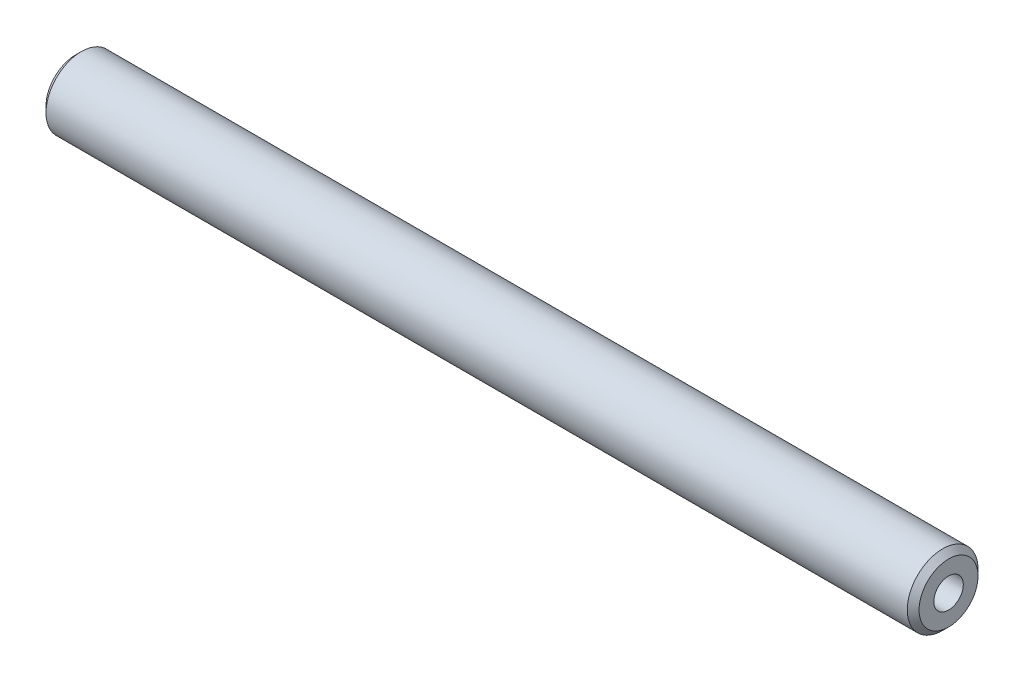
ISO-10303-21;
HEADER;
FILE_DESCRIPTION(('STEP AP214'),'2;1');
FILE_NAME('part.step','',(''),(''),'','','');
FILE_SCHEMA(('AUTOMOTIVE_DESIGN { 1 0 10303 214 1 1 1 1 }'));
ENDSEC;
DATA;
#1=APPLICATION_CONTEXT('core data for automotive mechanical design processes');
#2=APPLICATION_PROTOCOL_DEFINITION('international standard','automotive_design',2000,#1);
#3=PRODUCT_CONTEXT('',#1,'mechanical');
#4=PRODUCT('Part','Part','',(#3));
#5=PRODUCT_RELATED_PRODUCT_CATEGORY('part','',(#4));
#6=PRODUCT_DEFINITION_FORMATION('','',#4);
#7=PRODUCT_DEFINITION_CONTEXT('part definition',#1,'design');
#8=PRODUCT_DEFINITION('design','',#6,#7);
#9=PRODUCT_DEFINITION_SHAPE('','',#8);
#10=(LENGTH_UNIT() NAMED_UNIT(*) SI_UNIT(.MILLI.,.METRE.));
#11=(NAMED_UNIT(*) PLANE_ANGLE_UNIT() SI_UNIT($,.RADIAN.));
#12=(NAMED_UNIT(*) SI_UNIT($,.STERADIAN.) SOLID_ANGLE_UNIT());
#13=UNCERTAINTY_MEASURE_WITH_UNIT(LENGTH_MEASURE(1.E-05),#10,'distance_accuracy_value','');
#14=(GEOMETRIC_REPRESENTATION_CONTEXT(3) GLOBAL_UNCERTAINTY_ASSIGNED_CONTEXT((#13)) GLOBAL_UNIT_ASSIGNED_CONTEXT((#10,
#11,#12)) REPRESENTATION_CONTEXT('',''));
#15=CARTESIAN_POINT('',(0.,0.,0.));
#16=DIRECTION('',(0.,0.,1.));
#17=DIRECTION('',(1.,0.,0.));
#18=AXIS2_PLACEMENT_3D('',#15,#16,#17);
#19=CARTESIAN_POINT('',(0.,0.,0.));
#20=DIRECTION('',(1.,0.,0.));
#21=DIRECTION('',(0.,0.,-1.));
#22=AXIS2_PLACEMENT_3D('',#19,#20,#21);
#23=PLANE('',#22);
#24=CARTESIAN_POINT('',(0.,0.,0.));
#25=DIRECTION('',(1.,0.,0.));
#26=DIRECTION('',(0.,0.,-1.));
#27=AXIS2_PLACEMENT_3D('',#24,#25,#26);
#28=CIRCLE('',#27,2.49999999999999);
#29=CARTESIAN_POINT('',(0.,0.,-2.49999999999999));
#30=VERTEX_POINT('',#29);
#31=EDGE_CURVE('E78',#30,#30,#28,.F.);
#32=ORIENTED_EDGE('',*,*,#31,.T.);
#33=EDGE_LOOP('',(#32));
#34=FACE_BOUND('',#33,.T.);
#35=CARTESIAN_POINT('',(0.,0.,0.));
#36=DIRECTION('',(-1.,0.,0.));
#37=DIRECTION('',(0.,0.,1.));
#38=AXIS2_PLACEMENT_3D('',#35,#36,#37);
#39=CIRCLE('',#38,1.25);
#40=CARTESIAN_POINT('',(0.,0.,1.25));
#41=VERTEX_POINT('',#40);
#42=EDGE_CURVE('E67',#41,#41,#39,.T.);
#43=ORIENTED_EDGE('',*,*,#42,.F.);
#44=EDGE_LOOP('',(#43));
#45=FACE_BOUND('',#44,.T.);
#46=ADVANCED_FACE('F43',(#34,#45),#23,.F.);
#47=CARTESIAN_POINT('',(0.,0.,0.));
#48=DIRECTION('',(-1.,0.,0.));
#49=DIRECTION('',(0.,0.,1.));
#50=AXIS2_PLACEMENT_3D('',#47,#48,#49);
#51=CYLINDRICAL_SURFACE('',#50,3.);
#52=CARTESIAN_POINT('',(0.500000000000009,0.,0.));
#53=DIRECTION('',(1.,0.,0.));
#54=DIRECTION('',(0.,0.,-1.));
#55=AXIS2_PLACEMENT_3D('',#52,#53,#54);
#56=CIRCLE('',#55,3.);
#57=CARTESIAN_POINT('',(0.500000000000009,0.,-3.));
#58=VERTEX_POINT('',#57);
#59=EDGE_CURVE('E51',#58,#58,#56,.T.);
#60=ORIENTED_EDGE('',*,*,#59,.T.);
#61=EDGE_LOOP('',(#60));
#62=FACE_BOUND('',#61,.T.);
#63=CARTESIAN_POINT('',(73.5,0.,0.));
#64=DIRECTION('',(-1.,0.,0.));
#65=DIRECTION('',(0.,0.,1.));
#66=AXIS2_PLACEMENT_3D('',#63,#64,#65);
#67=CIRCLE('',#66,3.);
#68=CARTESIAN_POINT('',(73.5,0.,3.));
#69=VERTEX_POINT('',#68);
#70=EDGE_CURVE('E81',#69,#69,#67,.T.);
#71=ORIENTED_EDGE('',*,*,#70,.T.);
#72=EDGE_LOOP('',(#71));
#73=FACE_BOUND('',#72,.T.);
#74=ADVANCED_FACE('F86',(#62,#73),#51,.T.);
#75=CARTESIAN_POINT('',(74.,0.,0.));
#76=DIRECTION('',(-1.,0.,0.));
#77=DIRECTION('',(0.,0.,1.));
#78=AXIS2_PLACEMENT_3D('',#75,#76,#77);
#79=PLANE('',#78);
#80=CARTESIAN_POINT('',(74.,0.,0.));
#81=DIRECTION('',(-1.,0.,0.));
#82=DIRECTION('',(0.,0.,1.));
#83=AXIS2_PLACEMENT_3D('',#80,#81,#82);
#84=CIRCLE('',#83,2.49999999999999);
#85=CARTESIAN_POINT('',(74.,0.,2.49999999999999));
#86=VERTEX_POINT('',#85);
#87=EDGE_CURVE('E11',#86,#86,#84,.F.);
#88=ORIENTED_EDGE('',*,*,#87,.T.);
#89=EDGE_LOOP('',(#88));
#90=FACE_BOUND('',#89,.T.);
#91=CARTESIAN_POINT('',(74.,0.,0.));
#92=DIRECTION('',(1.,0.,0.));
#93=DIRECTION('',(0.,0.,-1.));
#94=AXIS2_PLACEMENT_3D('',#91,#92,#93);
#95=CIRCLE('',#94,1.24999999999999);
#96=CARTESIAN_POINT('',(74.,0.,-1.24999999999999));
#97=VERTEX_POINT('',#96);
#98=EDGE_CURVE('E68',#97,#97,#95,.T.);
#99=ORIENTED_EDGE('',*,*,#98,.F.);
#100=EDGE_LOOP('',(#99));
#101=FACE_BOUND('',#100,.T.);
#102=ADVANCED_FACE('F106',(#90,#101),#79,.F.);
#103=CARTESIAN_POINT('',(8.5,0.,0.));
#104=DIRECTION('',(-1.,0.,0.));
#105=DIRECTION('',(0.,0.,1.));
#106=AXIS2_PLACEMENT_3D('',#103,#104,#105);
#107=CONICAL_SURFACE('',#106,1.25,1.02974425867666);
#108=CARTESIAN_POINT('',(9.25107577378445,0.,0.));
#109=VERTEX_POINT('',#108);
#110=VERTEX_LOOP('',#109);
#111=FACE_BOUND('',#110,.T.);
#112=CARTESIAN_POINT('',(8.5,0.,0.));
#113=DIRECTION('',(-1.,0.,0.));
#114=DIRECTION('',(0.,0.,1.));
#115=AXIS2_PLACEMENT_3D('',#112,#113,#114);
#116=CIRCLE('',#115,1.25);
#117=CARTESIAN_POINT('',(8.5,0.,1.25));
#118=VERTEX_POINT('',#117);
#119=EDGE_CURVE('E71',#118,#118,#116,.T.);
#120=ORIENTED_EDGE('',*,*,#119,.T.);
#121=EDGE_LOOP('',(#120));
#122=FACE_BOUND('',#121,.T.);
#123=ADVANCED_FACE('F100',(#111,#122),#107,.F.);
#124=CARTESIAN_POINT('',(0.,0.,0.));
#125=DIRECTION('',(-1.,0.,0.));
#126=DIRECTION('',(0.,0.,1.));
#127=AXIS2_PLACEMENT_3D('',#124,#125,#126);
#128=CYLINDRICAL_SURFACE('',#127,1.25);
#129=ORIENTED_EDGE('',*,*,#119,.F.);
#130=EDGE_LOOP('',(#129));
#131=FACE_BOUND('',#130,.T.);
#132=ORIENTED_EDGE('',*,*,#42,.T.);
#133=EDGE_LOOP('',(#132));
#134=FACE_BOUND('',#133,.T.);
#135=ADVANCED_FACE('F61',(#131,#134),#128,.F.);
#136=CARTESIAN_POINT('',(65.5,0.,0.));
#137=DIRECTION('',(1.,0.,0.));
#138=DIRECTION('',(0.,0.,-1.));
#139=AXIS2_PLACEMENT_3D('',#136,#137,#138);
#140=CONICAL_SURFACE('',#139,1.24999999999999,1.02974425867665);
#141=CARTESIAN_POINT('',(64.7489242262156,0.,0.));
#142=VERTEX_POINT('',#141);
#143=VERTEX_LOOP('',#142);
#144=FACE_BOUND('',#143,.T.);
#145=CARTESIAN_POINT('',(65.5,0.,0.));
#146=DIRECTION('',(1.,0.,0.));
#147=DIRECTION('',(0.,0.,-1.));
#148=AXIS2_PLACEMENT_3D('',#145,#146,#147);
#149=CIRCLE('',#148,1.24999999999999);
#150=CARTESIAN_POINT('',(65.5,0.,-1.24999999999999));
#151=VERTEX_POINT('',#150);
#152=EDGE_CURVE('E65',#151,#151,#149,.T.);
#153=ORIENTED_EDGE('',*,*,#152,.T.);
#154=EDGE_LOOP('',(#153));
#155=FACE_BOUND('',#154,.T.);
#156=ADVANCED_FACE('F57',(#144,#155),#140,.F.);
#157=CARTESIAN_POINT('',(74.,0.,0.));
#158=DIRECTION('',(1.,0.,0.));
#159=DIRECTION('',(0.,0.,-1.));
#160=AXIS2_PLACEMENT_3D('',#157,#158,#159);
#161=CYLINDRICAL_SURFACE('',#160,1.24999999999999);
#162=ORIENTED_EDGE('',*,*,#152,.F.);
#163=EDGE_LOOP('',(#162));
#164=FACE_BOUND('',#163,.T.);
#165=ORIENTED_EDGE('',*,*,#98,.T.);
#166=EDGE_LOOP('',(#165));
#167=FACE_BOUND('',#166,.T.);
#168=ADVANCED_FACE('F60',(#164,#167),#161,.F.);
#169=CARTESIAN_POINT('',(0.,0.,0.));
#170=DIRECTION('',(1.,0.,0.));
#171=DIRECTION('',(0.,0.,-1.));
#172=AXIS2_PLACEMENT_3D('',#169,#170,#171);
#173=CONICAL_SURFACE('',#172,2.49999999999999,0.785398163397445);
#174=ORIENTED_EDGE('',*,*,#59,.F.);
#175=EDGE_LOOP('',(#174));
#176=FACE_BOUND('',#175,.T.);
#177=ORIENTED_EDGE('',*,*,#31,.F.);
#178=EDGE_LOOP('',(#177));
#179=FACE_BOUND('',#178,.T.);
#180=ADVANCED_FACE('F89',(#176,#179),#173,.T.);
#181=CARTESIAN_POINT('',(73.5,0.,0.));
#182=DIRECTION('',(-1.,0.,0.));
#183=DIRECTION('',(0.,0.,1.));
#184=AXIS2_PLACEMENT_3D('',#181,#182,#183);
#185=CONICAL_SURFACE('',#184,3.,0.785398163397439);
#186=ORIENTED_EDGE('',*,*,#87,.F.);
#187=EDGE_LOOP('',(#186));
#188=FACE_BOUND('',#187,.T.);
#189=ORIENTED_EDGE('',*,*,#70,.F.);
#190=EDGE_LOOP('',(#189));
#191=FACE_BOUND('',#190,.T.);
#192=ADVANCED_FACE('F45',(#188,#191),#185,.T.);
#193=CLOSED_SHELL('',(#46,#74,#102,#123,#135,#156,#168,#180,#192));
#194=MANIFOLD_SOLID_BREP('B2',#193);
#195=ADVANCED_BREP_SHAPE_REPRESENTATION('',(#18,#194),#14);
#196=SHAPE_DEFINITION_REPRESENTATION(#9,#195);
ENDSEC;
END-ISO-10303-21;
